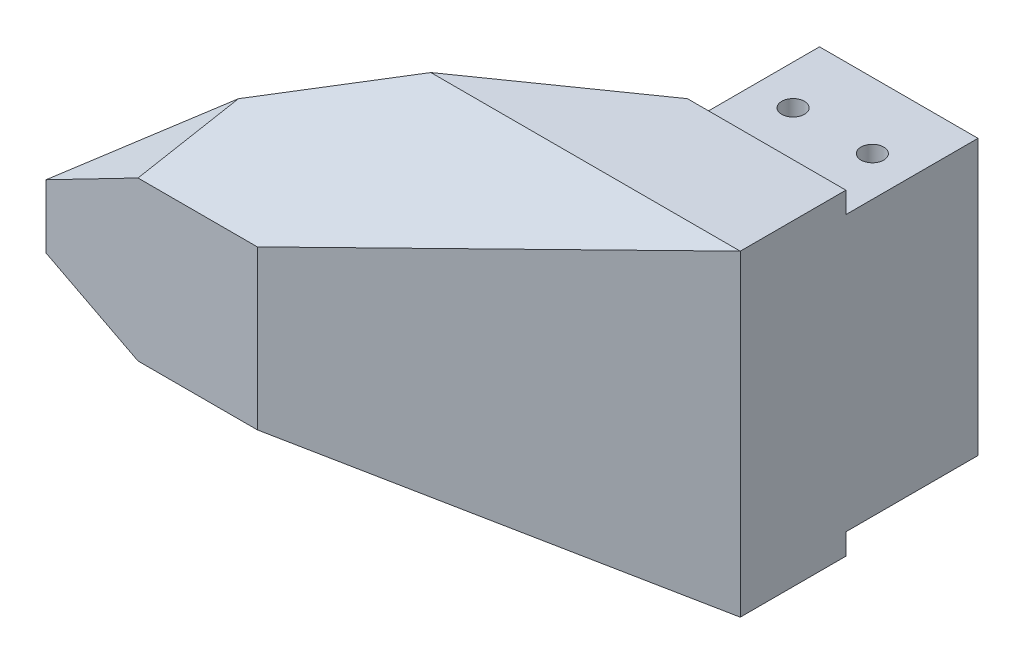
ISO-10303-21;
HEADER;
FILE_DESCRIPTION(('STEP AP214'),'2;1');
FILE_NAME('part.step','',(''),(''),'','','');
FILE_SCHEMA(('AUTOMOTIVE_DESIGN { 1 0 10303 214 1 1 1 1 }'));
ENDSEC;
DATA;
#1=APPLICATION_CONTEXT('core data for automotive mechanical design processes');
#2=APPLICATION_PROTOCOL_DEFINITION('international standard','automotive_design',2000,#1);
#3=PRODUCT_CONTEXT('',#1,'mechanical');
#4=PRODUCT('Part','Part','',(#3));
#5=PRODUCT_RELATED_PRODUCT_CATEGORY('part','',(#4));
#6=PRODUCT_DEFINITION_FORMATION('','',#4);
#7=PRODUCT_DEFINITION_CONTEXT('part definition',#1,'design');
#8=PRODUCT_DEFINITION('design','',#6,#7);
#9=PRODUCT_DEFINITION_SHAPE('','',#8);
#10=(LENGTH_UNIT() NAMED_UNIT(*) SI_UNIT(.MILLI.,.METRE.));
#11=(NAMED_UNIT(*) PLANE_ANGLE_UNIT() SI_UNIT($,.RADIAN.));
#12=(NAMED_UNIT(*) SI_UNIT($,.STERADIAN.) SOLID_ANGLE_UNIT());
#13=UNCERTAINTY_MEASURE_WITH_UNIT(LENGTH_MEASURE(1.E-05),#10,'distance_accuracy_value','');
#14=(GEOMETRIC_REPRESENTATION_CONTEXT(3) GLOBAL_UNCERTAINTY_ASSIGNED_CONTEXT((#13)) GLOBAL_UNIT_ASSIGNED_CONTEXT((#10,
#11,#12)) REPRESENTATION_CONTEXT('',''));
#15=CARTESIAN_POINT('',(0.,0.,0.));
#16=DIRECTION('',(0.,0.,1.));
#17=DIRECTION('',(1.,0.,0.));
#18=AXIS2_PLACEMENT_3D('',#15,#16,#17);
#19=CARTESIAN_POINT('',(71.4074003371065,30.,-75.));
#20=DIRECTION('',(0.,0.,1.));
#21=DIRECTION('',(1.,0.,0.));
#22=AXIS2_PLACEMENT_3D('',#19,#20,#21);
#23=PLANE('',#22);
#24=CARTESIAN_POINT('',(86.4074003371065,15.,-75.));
#25=DIRECTION('',(0.,0.,-1.));
#26=DIRECTION('',(-1.,0.,0.));
#27=AXIS2_PLACEMENT_3D('',#24,#25,#26);
#28=CIRCLE('',#27,5.);
#29=CARTESIAN_POINT('',(81.4074003371065,15.,-75.));
#30=VERTEX_POINT('',#29);
#31=EDGE_CURVE('E451',#30,#30,#28,.T.);
#32=ORIENTED_EDGE('',*,*,#31,.F.);
#33=EDGE_LOOP('',(#32));
#34=FACE_BOUND('',#33,.T.);
#35=DIRECTION('',(0.,-1.,0.));
#36=VECTOR('',#35,1.);
#37=CARTESIAN_POINT('',(71.4074003371065,30.,-75.));
#38=LINE('',#37,#36);
#39=CARTESIAN_POINT('',(71.4074003371065,41.,-75.));
#40=VERTEX_POINT('',#39);
#41=CARTESIAN_POINT('',(71.4074003371065,-11.,-75.));
#42=VERTEX_POINT('',#41);
#43=EDGE_CURVE('E141',#40,#42,#38,.T.);
#44=ORIENTED_EDGE('',*,*,#43,.F.);
#45=DIRECTION('',(-1.,0.,0.));
#46=VECTOR('',#45,1.);
#47=CARTESIAN_POINT('',(101.407400337107,41.,-75.));
#48=LINE('',#47,#46);
#49=CARTESIAN_POINT('',(101.407400337107,41.,-75.));
#50=VERTEX_POINT('',#49);
#51=EDGE_CURVE('E127',#50,#40,#48,.T.);
#52=ORIENTED_EDGE('',*,*,#51,.F.);
#53=DIRECTION('',(0.,-1.,0.));
#54=VECTOR('',#53,1.);
#55=CARTESIAN_POINT('',(101.407400337107,30.,-75.));
#56=LINE('',#55,#54);
#57=CARTESIAN_POINT('',(101.407400337107,-11.,-75.));
#58=VERTEX_POINT('',#57);
#59=EDGE_CURVE('E139',#50,#58,#56,.T.);
#60=ORIENTED_EDGE('',*,*,#59,.T.);
#61=DIRECTION('',(1.,0.,0.));
#62=VECTOR('',#61,1.);
#63=CARTESIAN_POINT('',(101.407400337107,-11.,-75.));
#64=LINE('',#63,#62);
#65=EDGE_CURVE('E214',#42,#58,#64,.T.);
#66=ORIENTED_EDGE('',*,*,#65,.F.);
#67=EDGE_LOOP('',(#44,#52,#60,#66));
#68=FACE_BOUND('',#67,.T.);
#69=ADVANCED_FACE('F36',(#34,#68),#23,.F.);
#70=CARTESIAN_POINT('',(71.4074003371065,30.,-50.));
#71=DIRECTION('',(1.,0.,0.));
#72=DIRECTION('',(0.,0.,-1.));
#73=AXIS2_PLACEMENT_3D('',#70,#71,#72);
#74=PLANE('',#73);
#75=DIRECTION('',(0.,-1.,0.));
#76=VECTOR('',#75,1.);
#77=CARTESIAN_POINT('',(71.4074003371065,30.,-50.));
#78=LINE('',#77,#76);
#79=CARTESIAN_POINT('',(71.4074003371065,41.,-50.));
#80=VERTEX_POINT('',#79);
#81=CARTESIAN_POINT('',(71.4074003371065,-11.,-50.));
#82=VERTEX_POINT('',#81);
#83=EDGE_CURVE('E191',#80,#82,#78,.T.);
#84=ORIENTED_EDGE('',*,*,#83,.F.);
#85=DIRECTION('',(0.,0.,1.));
#86=VECTOR('',#85,1.);
#87=CARTESIAN_POINT('',(71.4074003371065,41.,-75.));
#88=LINE('',#87,#86);
#89=EDGE_CURVE('E142',#40,#80,#88,.T.);
#90=ORIENTED_EDGE('',*,*,#89,.F.);
#91=ORIENTED_EDGE('',*,*,#43,.T.);
#92=DIRECTION('',(0.,0.,-1.));
#93=VECTOR('',#92,1.);
#94=CARTESIAN_POINT('',(71.4074003371065,-11.,-75.));
#95=LINE('',#94,#93);
#96=EDGE_CURVE('E211',#82,#42,#95,.T.);
#97=ORIENTED_EDGE('',*,*,#96,.F.);
#98=EDGE_LOOP('',(#84,#90,#91,#97));
#99=FACE_BOUND('',#98,.T.);
#100=ADVANCED_FACE('F213',(#99),#74,.F.);
#101=CARTESIAN_POINT('',(40.,30.,0.));
#102=DIRECTION('',(0.,0.,-1.));
#103=DIRECTION('',(-1.,0.,0.));
#104=AXIS2_PLACEMENT_3D('',#101,#102,#103);
#105=PLANE('',#104);
#106=DIRECTION('',(1.,0.,0.));
#107=VECTOR('',#106,1.);
#108=CARTESIAN_POINT('',(40.,30.,0.));
#109=LINE('',#108,#107);
#110=CARTESIAN_POINT('',(17.4138180950604,30.,0.));
#111=VERTEX_POINT('',#110);
#112=CARTESIAN_POINT('',(40.,30.,0.));
#113=VERTEX_POINT('',#112);
#114=EDGE_CURVE('E183',#111,#113,#109,.T.);
#115=ORIENTED_EDGE('',*,*,#114,.F.);
#116=DIRECTION('',(-0.888366385841765,-0.459135235531363,0.));
#117=VECTOR('',#116,1.);
#118=CARTESIAN_POINT('',(35.2387162079568,39.2124588726222,0.));
#119=LINE('',#118,#117);
#120=CARTESIAN_POINT('',(0.,21.,0.));
#121=VERTEX_POINT('',#120);
#122=EDGE_CURVE('E58',#111,#121,#119,.T.);
#123=ORIENTED_EDGE('',*,*,#122,.T.);
#124=DIRECTION('',(0.,-1.,0.));
#125=VECTOR('',#124,1.);
#126=CARTESIAN_POINT('',(0.,30.,0.));
#127=LINE('',#126,#125);
#128=CARTESIAN_POINT('',(0.,9.,0.));
#129=VERTEX_POINT('',#128);
#130=EDGE_CURVE('E178',#121,#129,#127,.T.);
#131=ORIENTED_EDGE('',*,*,#130,.T.);
#132=DIRECTION('',(0.888366385841765,-0.459135235531363,0.));
#133=VECTOR('',#132,1.);
#134=CARTESIAN_POINT('',(23.0023069139087,-2.88830393742893,0.));
#135=LINE('',#134,#133);
#136=CARTESIAN_POINT('',(17.4138180950604,0.,0.));
#137=VERTEX_POINT('',#136);
#138=EDGE_CURVE('E164',#129,#137,#135,.T.);
#139=ORIENTED_EDGE('',*,*,#138,.T.);
#140=DIRECTION('',(1.,0.,0.));
#141=VECTOR('',#140,1.);
#142=CARTESIAN_POINT('',(40.,0.,0.));
#143=LINE('',#142,#141);
#144=CARTESIAN_POINT('',(40.0000000000001,0.,0.));
#145=VERTEX_POINT('',#144);
#146=EDGE_CURVE('E175',#137,#145,#143,.T.);
#147=ORIENTED_EDGE('',*,*,#146,.T.);
#148=DIRECTION('',(0.,-1.,0.));
#149=VECTOR('',#148,1.);
#150=CARTESIAN_POINT('',(40.,30.,0.));
#151=LINE('',#150,#149);
#152=EDGE_CURVE('E150',#113,#145,#151,.T.);
#153=ORIENTED_EDGE('',*,*,#152,.F.);
#154=EDGE_LOOP('',(#115,#123,#131,#139,#147,#153));
#155=FACE_BOUND('',#154,.T.);
#156=ADVANCED_FACE('F38',(#155),#105,.F.);
#157=CARTESIAN_POINT('',(101.407400337107,30.,-30.));
#158=DIRECTION('',(-0.438957445353124,0.,-0.898507852591762));
#159=DIRECTION('',(-0.898507852591762,0.,0.438957445353124));
#160=AXIS2_PLACEMENT_3D('',#157,#158,#159);
#161=PLANE('',#160);
#162=ORIENTED_EDGE('',*,*,#152,.T.);
#163=DIRECTION('',(0.877618613830245,-0.214376103453103,-0.428752206906207));
#164=VECTOR('',#163,1.);
#165=CARTESIAN_POINT('',(23.3019571526603,4.0788348201535,8.157669640307));
#166=LINE('',#165,#164);
#167=CARTESIAN_POINT('',(101.407400337107,-15.,-30.));
#168=VERTEX_POINT('',#167);
#169=EDGE_CURVE('E158',#145,#168,#166,.T.);
#170=ORIENTED_EDGE('',*,*,#169,.T.);
#171=DIRECTION('',(0.,-1.,0.));
#172=VECTOR('',#171,1.);
#173=CARTESIAN_POINT('',(101.407400337107,30.,-30.));
#174=LINE('',#173,#172);
#175=CARTESIAN_POINT('',(101.407400337107,45.,-30.));
#176=VERTEX_POINT('',#175);
#177=EDGE_CURVE('E148',#176,#168,#174,.T.);
#178=ORIENTED_EDGE('',*,*,#177,.F.);
#179=DIRECTION('',(-0.877618613830246,-0.214376103453103,0.428752206906207));
#180=VECTOR('',#179,1.);
#181=CARTESIAN_POINT('',(9.19142274634713,22.4743816499663,15.0512367000674));
#182=LINE('',#181,#180);
#183=EDGE_CURVE('E234',#176,#113,#182,.T.);
#184=ORIENTED_EDGE('',*,*,#183,.T.);
#185=EDGE_LOOP('',(#162,#170,#178,#184));
#186=FACE_BOUND('',#185,.T.);
#187=ADVANCED_FACE('F248',(#186),#161,.F.);
#188=CARTESIAN_POINT('',(101.407400337107,30.,-75.));
#189=DIRECTION('',(-1.,0.,0.));
#190=DIRECTION('',(0.,0.,1.));
#191=AXIS2_PLACEMENT_3D('',#188,#189,#190);
#192=PLANE('',#191);
#193=DIRECTION('',(0.,0.,-1.));
#194=VECTOR('',#193,1.);
#195=CARTESIAN_POINT('',(101.407400337107,41.,-75.));
#196=LINE('',#195,#194);
#197=CARTESIAN_POINT('',(101.407400337107,41.,-50.));
#198=VERTEX_POINT('',#197);
#199=EDGE_CURVE('E124',#198,#50,#196,.T.);
#200=ORIENTED_EDGE('',*,*,#199,.F.);
#201=DIRECTION('',(0.,1.,0.));
#202=VECTOR('',#201,1.);
#203=CARTESIAN_POINT('',(101.407400337107,41.,-50.));
#204=LINE('',#203,#202);
#205=CARTESIAN_POINT('',(101.407400337107,45.,-50.));
#206=VERTEX_POINT('',#205);
#207=EDGE_CURVE('E219',#198,#206,#204,.T.);
#208=ORIENTED_EDGE('',*,*,#207,.T.);
#209=DIRECTION('',(0.,0.,1.));
#210=VECTOR('',#209,1.);
#211=CARTESIAN_POINT('',(101.407400337107,45.,-30.));
#212=LINE('',#211,#210);
#213=EDGE_CURVE('E188',#206,#176,#212,.T.);
#214=ORIENTED_EDGE('',*,*,#213,.T.);
#215=ORIENTED_EDGE('',*,*,#177,.T.);
#216=DIRECTION('',(0.,0.,-1.));
#217=VECTOR('',#216,1.);
#218=CARTESIAN_POINT('',(101.407400337107,-15.,-75.));
#219=LINE('',#218,#217);
#220=CARTESIAN_POINT('',(101.407400337107,-15.,-50.));
#221=VERTEX_POINT('',#220);
#222=EDGE_CURVE('E237',#168,#221,#219,.T.);
#223=ORIENTED_EDGE('',*,*,#222,.T.);
#224=DIRECTION('',(0.,-1.,0.));
#225=VECTOR('',#224,1.);
#226=CARTESIAN_POINT('',(101.407400337107,-11.,-50.));
#227=LINE('',#226,#225);
#228=CARTESIAN_POINT('',(101.407400337107,-11.,-50.));
#229=VERTEX_POINT('',#228);
#230=EDGE_CURVE('E51',#229,#221,#227,.T.);
#231=ORIENTED_EDGE('',*,*,#230,.F.);
#232=DIRECTION('',(0.,0.,1.));
#233=VECTOR('',#232,1.);
#234=CARTESIAN_POINT('',(101.407400337107,-11.,-75.));
#235=LINE('',#234,#233);
#236=EDGE_CURVE('E147',#58,#229,#235,.T.);
#237=ORIENTED_EDGE('',*,*,#236,.F.);
#238=ORIENTED_EDGE('',*,*,#59,.F.);
#239=EDGE_LOOP('',(#200,#208,#214,#215,#223,#231,#237,#238));
#240=FACE_BOUND('',#239,.T.);
#241=ADVANCED_FACE('F145',(#240),#192,.F.);
#242=CARTESIAN_POINT('',(0.,30.,0.));
#243=DIRECTION('',(0.573576436351042,0.,0.819152044288995));
#244=DIRECTION('',(0.819152044288995,0.,-0.573576436351042));
#245=AXIS2_PLACEMENT_3D('',#242,#243,#244);
#246=PLANE('',#245);
#247=ORIENTED_EDGE('',*,*,#130,.F.);
#248=DIRECTION('',(-0.692785592880849,-0.533603063948073,0.485093694498248));
#249=VECTOR('',#248,1.);
#250=CARTESIAN_POINT('',(0.,21.,0.));
#251=LINE('',#250,#249);
#252=CARTESIAN_POINT('',(21.422220101132,37.5,-15.));
#253=VERTEX_POINT('',#252);
#254=EDGE_CURVE('E179',#253,#121,#251,.T.);
#255=ORIENTED_EDGE('',*,*,#254,.F.);
#256=DIRECTION('',(0.787410546494737,0.275675400160718,-0.551350800321436));
#257=VECTOR('',#256,1.);
#258=CARTESIAN_POINT('',(0.,30.,0.));
#259=LINE('',#258,#257);
#260=CARTESIAN_POINT('',(42.8444402022639,45.,-30.));
#261=VERTEX_POINT('',#260);
#262=EDGE_CURVE('E232',#253,#261,#259,.T.);
#263=ORIENTED_EDGE('',*,*,#262,.T.);
#264=DIRECTION('',(-0.819152044288995,0.,0.573576436351042));
#265=VECTOR('',#264,1.);
#266=CARTESIAN_POINT('',(71.4074003371065,45.,-50.));
#267=LINE('',#266,#265);
#268=CARTESIAN_POINT('',(71.4074003371065,45.,-50.));
#269=VERTEX_POINT('',#268);
#270=EDGE_CURVE('E226',#269,#261,#267,.T.);
#271=ORIENTED_EDGE('',*,*,#270,.F.);
#272=EDGE_CURVE('E152',#269,#80,#78,.T.);
#273=ORIENTED_EDGE('',*,*,#272,.T.);
#274=ORIENTED_EDGE('',*,*,#83,.T.);
#275=DIRECTION('',(0.,-1.,0.));
#276=VECTOR('',#275,1.);
#277=CARTESIAN_POINT('',(71.4074003371065,-11.,-50.));
#278=LINE('',#277,#276);
#279=CARTESIAN_POINT('',(71.4074003371065,-15.,-50.));
#280=VERTEX_POINT('',#279);
#281=EDGE_CURVE('E199',#82,#280,#278,.T.);
#282=ORIENTED_EDGE('',*,*,#281,.T.);
#283=DIRECTION('',(-0.819152044288995,0.,0.573576436351042));
#284=VECTOR('',#283,1.);
#285=CARTESIAN_POINT('',(71.4074003371065,-15.,-50.));
#286=LINE('',#285,#284);
#287=CARTESIAN_POINT('',(42.8444402022639,-15.,-30.));
#288=VERTEX_POINT('',#287);
#289=EDGE_CURVE('E225',#280,#288,#286,.T.);
#290=ORIENTED_EDGE('',*,*,#289,.T.);
#291=DIRECTION('',(-0.787410546494737,0.275675400160718,0.551350800321436));
#292=VECTOR('',#291,1.);
#293=CARTESIAN_POINT('',(16.280228812178,-5.69976946903289,-11.3995389380658));
#294=LINE('',#293,#292);
#295=CARTESIAN_POINT('',(21.422220101132,-7.5,-15.));
#296=VERTEX_POINT('',#295);
#297=EDGE_CURVE('E229',#288,#296,#294,.T.);
#298=ORIENTED_EDGE('',*,*,#297,.T.);
#299=DIRECTION('',(0.692785592880849,-0.533603063948073,-0.485093694498248));
#300=VECTOR('',#299,1.);
#301=CARTESIAN_POINT('',(21.4222201011319,-7.5,-15.));
#302=LINE('',#301,#300);
#303=EDGE_CURVE('E166',#129,#296,#302,.T.);
#304=ORIENTED_EDGE('',*,*,#303,.F.);
#305=EDGE_LOOP('',(#247,#255,#263,#271,#273,#274,#282,#290,#298,#304));
#306=FACE_BOUND('',#305,.T.);
#307=ADVANCED_FACE('F198',(#306),#246,.F.);
#308=CARTESIAN_POINT('',(0.,30.,0.));
#309=DIRECTION('',(0.,0.894427190999916,0.447213595499958));
#310=DIRECTION('',(0.,-0.447213595499958,0.894427190999916));
#311=AXIS2_PLACEMENT_3D('',#308,#309,#310);
#312=PLANE('',#311);
#313=DIRECTION('',(0.232466935443777,0.434961865897547,-0.869923731795094));
#314=VECTOR('',#313,1.);
#315=CARTESIAN_POINT('',(16.4727601093993,28.239214808852,3.52157038229605));
#316=LINE('',#315,#314);
#317=EDGE_CURVE('E11',#111,#253,#316,.T.);
#318=ORIENTED_EDGE('',*,*,#317,.F.);
#319=ORIENTED_EDGE('',*,*,#114,.T.);
#320=ORIENTED_EDGE('',*,*,#183,.F.);
#321=DIRECTION('',(1.,0.,0.));
#322=VECTOR('',#321,1.);
#323=CARTESIAN_POINT('',(0.,45.,-30.));
#324=LINE('',#323,#322);
#325=EDGE_CURVE('E184',#261,#176,#324,.T.);
#326=ORIENTED_EDGE('',*,*,#325,.F.);
#327=ORIENTED_EDGE('',*,*,#262,.F.);
#328=EDGE_LOOP('',(#318,#319,#320,#326,#327));
#329=FACE_BOUND('',#328,.T.);
#330=ADVANCED_FACE('F251',(#329),#312,.T.);
#331=CARTESIAN_POINT('',(0.,45.,-30.));
#332=DIRECTION('',(0.,1.,0.));
#333=DIRECTION('',(0.,0.,1.));
#334=AXIS2_PLACEMENT_3D('',#331,#332,#333);
#335=PLANE('',#334);
#336=DIRECTION('',(1.,0.,0.));
#337=VECTOR('',#336,1.);
#338=CARTESIAN_POINT('',(101.407400337107,45.,-50.));
#339=LINE('',#338,#337);
#340=EDGE_CURVE('E134',#269,#206,#339,.T.);
#341=ORIENTED_EDGE('',*,*,#340,.F.);
#342=ORIENTED_EDGE('',*,*,#270,.T.);
#343=ORIENTED_EDGE('',*,*,#325,.T.);
#344=ORIENTED_EDGE('',*,*,#213,.F.);
#345=EDGE_LOOP('',(#341,#342,#343,#344));
#346=FACE_BOUND('',#345,.T.);
#347=ADVANCED_FACE('F253',(#346),#335,.T.);
#348=CARTESIAN_POINT('',(0.,-15.,-30.));
#349=DIRECTION('',(0.,-0.894427190999916,0.447213595499958));
#350=DIRECTION('',(0.,-0.447213595499958,-0.894427190999916));
#351=AXIS2_PLACEMENT_3D('',#348,#349,#350);
#352=PLANE('',#351);
#353=DIRECTION('',(-0.232466935443778,0.434961865897547,0.869923731795094));
#354=VECTOR('',#353,1.);
#355=CARTESIAN_POINT('',(24.0563290094075,-12.4286016677326,-24.8572033354653));
#356=LINE('',#355,#354);
#357=EDGE_CURVE('E44',#296,#137,#356,.T.);
#358=ORIENTED_EDGE('',*,*,#357,.F.);
#359=ORIENTED_EDGE('',*,*,#297,.F.);
#360=DIRECTION('',(1.,0.,0.));
#361=VECTOR('',#360,1.);
#362=CARTESIAN_POINT('',(0.,-15.,-30.));
#363=LINE('',#362,#361);
#364=EDGE_CURVE('E240',#288,#168,#363,.T.);
#365=ORIENTED_EDGE('',*,*,#364,.T.);
#366=ORIENTED_EDGE('',*,*,#169,.F.);
#367=ORIENTED_EDGE('',*,*,#146,.F.);
#368=EDGE_LOOP('',(#358,#359,#365,#366,#367));
#369=FACE_BOUND('',#368,.T.);
#370=ADVANCED_FACE('F181',(#369),#352,.T.);
#371=CARTESIAN_POINT('',(0.,-15.,-75.));
#372=DIRECTION('',(0.,-1.,0.));
#373=DIRECTION('',(0.,0.,-1.));
#374=AXIS2_PLACEMENT_3D('',#371,#372,#373);
#375=PLANE('',#374);
#376=DIRECTION('',(-1.,0.,0.));
#377=VECTOR('',#376,1.);
#378=CARTESIAN_POINT('',(101.407400337107,-15.,-50.));
#379=LINE('',#378,#377);
#380=EDGE_CURVE('E206',#221,#280,#379,.T.);
#381=ORIENTED_EDGE('',*,*,#380,.F.);
#382=ORIENTED_EDGE('',*,*,#222,.F.);
#383=ORIENTED_EDGE('',*,*,#364,.F.);
#384=ORIENTED_EDGE('',*,*,#289,.F.);
#385=EDGE_LOOP('',(#381,#382,#383,#384));
#386=FACE_BOUND('',#385,.T.);
#387=ADVANCED_FACE('F258',(#386),#375,.T.);
#388=CARTESIAN_POINT('',(54.7842334708944,-7.5,32.6458928949306));
#389=DIRECTION('',(0.437102040671935,0.845735047248977,-0.306062143845333));
#390=DIRECTION('',(-0.888366385841765,0.459135235531363,0.));
#391=AXIS2_PLACEMENT_3D('',#388,#389,#390);
#392=PLANE('',#391);
#393=ORIENTED_EDGE('',*,*,#303,.T.);
#394=ORIENTED_EDGE('',*,*,#357,.T.);
#395=ORIENTED_EDGE('',*,*,#138,.F.);
#396=EDGE_LOOP('',(#393,#394,#395));
#397=FACE_BOUND('',#396,.T.);
#398=ADVANCED_FACE('F163',(#397),#392,.F.);
#399=CARTESIAN_POINT('',(33.3620133697624,21.,47.6458928949306));
#400=DIRECTION('',(0.437102040671935,-0.845735047248977,-0.306062143845333));
#401=DIRECTION('',(0.888366385841765,0.459135235531363,0.));
#402=AXIS2_PLACEMENT_3D('',#399,#400,#401);
#403=PLANE('',#402);
#404=ORIENTED_EDGE('',*,*,#317,.T.);
#405=ORIENTED_EDGE('',*,*,#254,.T.);
#406=ORIENTED_EDGE('',*,*,#122,.F.);
#407=EDGE_LOOP('',(#404,#405,#406));
#408=FACE_BOUND('',#407,.T.);
#409=ADVANCED_FACE('F265',(#408),#403,.F.);
#410=CARTESIAN_POINT('',(101.407400337107,-11.,-50.));
#411=DIRECTION('',(0.,0.,1.));
#412=DIRECTION('',(0.,-1.,0.));
#413=AXIS2_PLACEMENT_3D('',#410,#411,#412);
#414=PLANE('',#413);
#415=ORIENTED_EDGE('',*,*,#380,.T.);
#416=ORIENTED_EDGE('',*,*,#281,.F.);
#417=DIRECTION('',(-1.,0.,0.));
#418=VECTOR('',#417,1.);
#419=CARTESIAN_POINT('',(101.407400337107,-11.,-50.));
#420=LINE('',#419,#418);
#421=EDGE_CURVE('E205',#229,#82,#420,.T.);
#422=ORIENTED_EDGE('',*,*,#421,.F.);
#423=ORIENTED_EDGE('',*,*,#230,.T.);
#424=EDGE_LOOP('',(#415,#416,#422,#423));
#425=FACE_BOUND('',#424,.T.);
#426=ADVANCED_FACE('F204',(#425),#414,.F.);
#427=CARTESIAN_POINT('',(0.,-11.,0.));
#428=DIRECTION('',(0.,-1.,0.));
#429=DIRECTION('',(0.,0.,-1.));
#430=AXIS2_PLACEMENT_3D('',#427,#428,#429);
#431=PLANE('',#430);
#432=CARTESIAN_POINT('',(78.9074003371065,-11.,-62.5));
#433=DIRECTION('',(0.,-1.,0.));
#434=DIRECTION('',(0.,0.,-1.));
#435=AXIS2_PLACEMENT_3D('',#432,#433,#434);
#436=CIRCLE('',#435,2.15);
#437=CARTESIAN_POINT('',(78.9074003371065,-11.,-60.35));
#438=VERTEX_POINT('',#437);
#439=EDGE_CURVE('E464',#438,#438,#436,.T.);
#440=ORIENTED_EDGE('',*,*,#439,.F.);
#441=EDGE_LOOP('',(#440));
#442=FACE_BOUND('',#441,.T.);
#443=CARTESIAN_POINT('',(93.9074003371065,-11.,-62.5));
#444=DIRECTION('',(0.,-1.,0.));
#445=DIRECTION('',(0.,0.,-1.));
#446=AXIS2_PLACEMENT_3D('',#443,#444,#445);
#447=CIRCLE('',#446,2.15);
#448=CARTESIAN_POINT('',(93.9074003371065,-11.,-60.35));
#449=VERTEX_POINT('',#448);
#450=EDGE_CURVE('E460',#449,#449,#447,.T.);
#451=ORIENTED_EDGE('',*,*,#450,.F.);
#452=EDGE_LOOP('',(#451));
#453=FACE_BOUND('',#452,.T.);
#454=ORIENTED_EDGE('',*,*,#236,.T.);
#455=ORIENTED_EDGE('',*,*,#421,.T.);
#456=ORIENTED_EDGE('',*,*,#96,.T.);
#457=ORIENTED_EDGE('',*,*,#65,.T.);
#458=EDGE_LOOP('',(#454,#455,#456,#457));
#459=FACE_BOUND('',#458,.T.);
#460=ADVANCED_FACE('F210',(#442,#453,#459),#431,.T.);
#461=CARTESIAN_POINT('',(101.407400337107,41.,-50.));
#462=DIRECTION('',(0.,0.,1.));
#463=DIRECTION('',(1.,0.,0.));
#464=AXIS2_PLACEMENT_3D('',#461,#462,#463);
#465=PLANE('',#464);
#466=ORIENTED_EDGE('',*,*,#340,.T.);
#467=ORIENTED_EDGE('',*,*,#207,.F.);
#468=DIRECTION('',(1.,0.,0.));
#469=VECTOR('',#468,1.);
#470=CARTESIAN_POINT('',(101.407400337107,41.,-50.));
#471=LINE('',#470,#469);
#472=EDGE_CURVE('E130',#80,#198,#471,.T.);
#473=ORIENTED_EDGE('',*,*,#472,.F.);
#474=ORIENTED_EDGE('',*,*,#272,.F.);
#475=EDGE_LOOP('',(#466,#467,#473,#474));
#476=FACE_BOUND('',#475,.T.);
#477=ADVANCED_FACE('F329',(#476),#465,.F.);
#478=CARTESIAN_POINT('',(0.,41.,0.));
#479=DIRECTION('',(0.,-1.,0.));
#480=DIRECTION('',(0.,0.,-1.));
#481=AXIS2_PLACEMENT_3D('',#478,#479,#480);
#482=PLANE('',#481);
#483=CARTESIAN_POINT('',(78.9074003371065,41.,-62.5));
#484=DIRECTION('',(0.,1.,0.));
#485=DIRECTION('',(0.,0.,1.));
#486=AXIS2_PLACEMENT_3D('',#483,#484,#485);
#487=CIRCLE('',#486,2.15);
#488=CARTESIAN_POINT('',(78.9074003371065,41.,-60.35));
#489=VERTEX_POINT('',#488);
#490=EDGE_CURVE('E454',#489,#489,#487,.T.);
#491=ORIENTED_EDGE('',*,*,#490,.F.);
#492=EDGE_LOOP('',(#491));
#493=FACE_BOUND('',#492,.T.);
#494=CARTESIAN_POINT('',(93.9074003371065,41.,-62.5));
#495=DIRECTION('',(0.,1.,0.));
#496=DIRECTION('',(0.,0.,1.));
#497=AXIS2_PLACEMENT_3D('',#494,#495,#496);
#498=CIRCLE('',#497,2.15);
#499=CARTESIAN_POINT('',(93.9074003371065,41.,-60.35));
#500=VERTEX_POINT('',#499);
#501=EDGE_CURVE('E450',#500,#500,#498,.T.);
#502=ORIENTED_EDGE('',*,*,#501,.F.);
#503=EDGE_LOOP('',(#502));
#504=FACE_BOUND('',#503,.T.);
#505=ORIENTED_EDGE('',*,*,#199,.T.);
#506=ORIENTED_EDGE('',*,*,#51,.T.);
#507=ORIENTED_EDGE('',*,*,#89,.T.);
#508=ORIENTED_EDGE('',*,*,#472,.T.);
#509=EDGE_LOOP('',(#505,#506,#507,#508));
#510=FACE_BOUND('',#509,.T.);
#511=ADVANCED_FACE('F126',(#493,#504,#510),#482,.F.);
#512=CARTESIAN_POINT('',(93.9074003371065,-15.,-62.5));
#513=DIRECTION('',(0.,1.,0.));
#514=DIRECTION('',(0.,0.,1.));
#515=AXIS2_PLACEMENT_3D('',#512,#513,#514);
#516=CYLINDRICAL_SURFACE('',#515,2.15);
#517=CARTESIAN_POINT('',(93.9074003371065,-11.,-60.35));
#518=CARTESIAN_POINT('',(93.9074003371065,-10.4583333333333,-60.35));
#519=CARTESIAN_POINT('',(93.9074003371065,-9.91666666666667,-60.35));
#520=CARTESIAN_POINT('',(93.9074003371065,-8.83333333333334,-60.35));
#521=CARTESIAN_POINT('',(93.9074003371065,-8.29166666666667,-60.35));
#522=CARTESIAN_POINT('',(93.9074003371065,-7.20833333333333,-60.35));
#523=CARTESIAN_POINT('',(93.9074003371065,-6.66666666666667,-60.35));
#524=CARTESIAN_POINT('',(93.9074003371065,-5.58333333333334,-60.35));
#525=CARTESIAN_POINT('',(93.9074003371065,-5.04166666666667,-60.35));
#526=CARTESIAN_POINT('',(93.9074003371065,-3.95833333333334,-60.35));
#527=CARTESIAN_POINT('',(93.9074003371065,-3.41666666666667,-60.35));
#528=CARTESIAN_POINT('',(93.9074003371065,-2.33333333333334,-60.35));
#529=CARTESIAN_POINT('',(93.9074003371065,-1.79166666666667,-60.35));
#530=CARTESIAN_POINT('',(93.9074003371065,-0.708333333333336,-60.35));
#531=CARTESIAN_POINT('',(93.9074003371065,-0.166666666666669,-60.35));
#532=CARTESIAN_POINT('',(93.9074003371065,0.916666666666663,-60.35));
#533=CARTESIAN_POINT('',(93.9074003371065,1.45833333333333,-60.35));
#534=CARTESIAN_POINT('',(93.9074003371065,2.54166666666666,-60.35));
#535=CARTESIAN_POINT('',(93.9074003371065,3.08333333333333,-60.35));
#536=CARTESIAN_POINT('',(93.9074003371065,4.16666666666666,-60.35));
#537=CARTESIAN_POINT('',(93.9074003371065,4.70833333333333,-60.35));
#538=CARTESIAN_POINT('',(93.9074003371065,5.79166666666666,-60.35));
#539=CARTESIAN_POINT('',(93.9074003371065,6.33333333333333,-60.35));
#540=CARTESIAN_POINT('',(93.9074003371065,7.41666666666666,-60.35));
#541=CARTESIAN_POINT('',(93.9074003371065,7.95833333333333,-60.35));
#542=CARTESIAN_POINT('',(93.9074003371065,9.04166666666666,-60.35));
#543=CARTESIAN_POINT('',(93.9074003371065,9.58333333333333,-60.35));
#544=CARTESIAN_POINT('',(93.9074003371065,10.6666666666667,-60.35));
#545=CARTESIAN_POINT('',(93.9074003371065,11.2083333333333,-60.35));
#546=CARTESIAN_POINT('',(93.9074003371065,12.2916666666667,-60.35));
#547=CARTESIAN_POINT('',(93.9074003371065,12.8333333333333,-60.35));
#548=CARTESIAN_POINT('',(93.9074003371065,13.9166666666667,-60.35));
#549=CARTESIAN_POINT('',(93.9074003371065,14.4583333333333,-60.35));
#550=CARTESIAN_POINT('',(93.9074003371065,15.5416666666667,-60.35));
#551=CARTESIAN_POINT('',(93.9074003371065,16.0833333333333,-60.35));
#552=CARTESIAN_POINT('',(93.9074003371065,17.1666666666667,-60.35));
#553=CARTESIAN_POINT('',(93.9074003371065,17.7083333333333,-60.35));
#554=CARTESIAN_POINT('',(93.9074003371065,18.7916666666667,-60.35));
#555=CARTESIAN_POINT('',(93.9074003371065,19.3333333333333,-60.35));
#556=CARTESIAN_POINT('',(93.9074003371065,20.4166666666667,-60.35));
#557=CARTESIAN_POINT('',(93.9074003371065,20.9583333333333,-60.35));
#558=CARTESIAN_POINT('',(93.9074003371065,22.0416666666667,-60.35));
#559=CARTESIAN_POINT('',(93.9074003371065,22.5833333333333,-60.35));
#560=CARTESIAN_POINT('',(93.9074003371065,23.6666666666667,-60.35));
#561=CARTESIAN_POINT('',(93.9074003371065,24.2083333333333,-60.35));
#562=CARTESIAN_POINT('',(93.9074003371065,25.2916666666667,-60.35));
#563=CARTESIAN_POINT('',(93.9074003371065,25.8333333333333,-60.35));
#564=CARTESIAN_POINT('',(93.9074003371065,26.9166666666667,-60.35));
#565=CARTESIAN_POINT('',(93.9074003371065,27.4583333333333,-60.35));
#566=CARTESIAN_POINT('',(93.9074003371065,28.5416666666667,-60.35));
#567=CARTESIAN_POINT('',(93.9074003371065,29.0833333333333,-60.35));
#568=CARTESIAN_POINT('',(93.9074003371065,30.1666666666667,-60.35));
#569=CARTESIAN_POINT('',(93.9074003371065,30.7083333333333,-60.35));
#570=CARTESIAN_POINT('',(93.9074003371065,31.7916666666667,-60.35));
#571=CARTESIAN_POINT('',(93.9074003371065,32.3333333333333,-60.35));
#572=CARTESIAN_POINT('',(93.9074003371065,33.4166666666667,-60.35));
#573=CARTESIAN_POINT('',(93.9074003371065,33.9583333333333,-60.35));
#574=CARTESIAN_POINT('',(93.9074003371065,35.0416666666667,-60.35));
#575=CARTESIAN_POINT('',(93.9074003371065,35.5833333333333,-60.35));
#576=CARTESIAN_POINT('',(93.9074003371065,36.6666666666667,-60.35));
#577=CARTESIAN_POINT('',(93.9074003371065,37.2083333333333,-60.35));
#578=CARTESIAN_POINT('',(93.9074003371065,38.2916666666667,-60.35));
#579=CARTESIAN_POINT('',(93.9074003371065,38.8333333333333,-60.35));
#580=CARTESIAN_POINT('',(93.9074003371065,39.9166666666667,-60.35));
#581=CARTESIAN_POINT('',(93.9074003371065,40.4583333333333,-60.35));
#582=CARTESIAN_POINT('',(93.9074003371065,41.,-60.35));
#583=B_SPLINE_CURVE_WITH_KNOTS('',3,(#517,#518,#519,#520,#521,#522,#523,#524,#525,#526,#527,
#528,#529,#530,#531,#532,#533,#534,#535,#536,#537,#538,#539,#540,#541,#542,#543,#544,#545,#546,
#547,#548,#549,#550,#551,#552,#553,#554,#555,#556,#557,#558,#559,#560,#561,#562,#563,#564,#565,
#566,#567,#568,#569,#570,#571,#572,#573,#574,#575,#576,#577,#578,#579,#580,#581,#582),
.UNSPECIFIED.,.F.,.F.,(4,2,2,2,2,2,2,2,2,2,2,2,2,2,2,2,2,2,2,2,2,2,2,2,2,2,2,2,2,2,2,2,4),(0.,
1.625,3.25,4.875,6.5,8.125,9.75,11.375,13.,14.625,16.25,17.875,19.5,21.125,22.75,24.375,26.,
27.625,29.25,30.875,32.5,34.125,35.75,37.375,39.,40.625,42.25,43.875,45.5,47.125,48.75,50.375,
52.),.UNSPECIFIED.);
#584=EDGE_CURVE('BSEAM352',#449,#500,#583,.T.);
#585=ORIENTED_EDGE('',*,*,#450,.T.);
#586=ORIENTED_EDGE('',*,*,#501,.T.);
#587=ORIENTED_EDGE('',*,*,#584,.T.);
#588=ORIENTED_EDGE('',*,*,#584,.F.);
#589=EDGE_LOOP('',(#585,#587,#586,#588));
#590=FACE_BOUND('',#589,.T.);
#591=ADVANCED_FACE('F352',(#590),#516,.F.);
#592=CARTESIAN_POINT('',(78.9074003371065,-15.,-62.5));
#593=DIRECTION('',(0.,1.,0.));
#594=DIRECTION('',(0.,0.,1.));
#595=AXIS2_PLACEMENT_3D('',#592,#593,#594);
#596=CYLINDRICAL_SURFACE('',#595,2.15);
#597=CARTESIAN_POINT('',(78.9074003371065,-11.,-60.35));
#598=CARTESIAN_POINT('',(78.9074003371065,-10.4583333333333,-60.35));
#599=CARTESIAN_POINT('',(78.9074003371065,-9.91666666666667,-60.35));
#600=CARTESIAN_POINT('',(78.9074003371065,-8.83333333333334,-60.35));
#601=CARTESIAN_POINT('',(78.9074003371065,-8.29166666666667,-60.35));
#602=CARTESIAN_POINT('',(78.9074003371065,-7.20833333333333,-60.35));
#603=CARTESIAN_POINT('',(78.9074003371065,-6.66666666666667,-60.35));
#604=CARTESIAN_POINT('',(78.9074003371065,-5.58333333333334,-60.35));
#605=CARTESIAN_POINT('',(78.9074003371065,-5.04166666666667,-60.35));
#606=CARTESIAN_POINT('',(78.9074003371065,-3.95833333333334,-60.35));
#607=CARTESIAN_POINT('',(78.9074003371065,-3.41666666666667,-60.35));
#608=CARTESIAN_POINT('',(78.9074003371065,-2.33333333333334,-60.35));
#609=CARTESIAN_POINT('',(78.9074003371065,-1.79166666666667,-60.35));
#610=CARTESIAN_POINT('',(78.9074003371065,-0.708333333333336,-60.35));
#611=CARTESIAN_POINT('',(78.9074003371065,-0.166666666666669,-60.35));
#612=CARTESIAN_POINT('',(78.9074003371065,0.916666666666663,-60.35));
#613=CARTESIAN_POINT('',(78.9074003371065,1.45833333333333,-60.35));
#614=CARTESIAN_POINT('',(78.9074003371065,2.54166666666666,-60.35));
#615=CARTESIAN_POINT('',(78.9074003371065,3.08333333333333,-60.35));
#616=CARTESIAN_POINT('',(78.9074003371065,4.16666666666666,-60.35));
#617=CARTESIAN_POINT('',(78.9074003371065,4.70833333333333,-60.35));
#618=CARTESIAN_POINT('',(78.9074003371065,5.79166666666666,-60.35));
#619=CARTESIAN_POINT('',(78.9074003371065,6.33333333333333,-60.35));
#620=CARTESIAN_POINT('',(78.9074003371065,7.41666666666666,-60.35));
#621=CARTESIAN_POINT('',(78.9074003371065,7.95833333333333,-60.35));
#622=CARTESIAN_POINT('',(78.9074003371065,9.04166666666666,-60.35));
#623=CARTESIAN_POINT('',(78.9074003371065,9.58333333333333,-60.35));
#624=CARTESIAN_POINT('',(78.9074003371065,10.6666666666667,-60.35));
#625=CARTESIAN_POINT('',(78.9074003371065,11.2083333333333,-60.35));
#626=CARTESIAN_POINT('',(78.9074003371065,12.2916666666667,-60.35));
#627=CARTESIAN_POINT('',(78.9074003371065,12.8333333333333,-60.35));
#628=CARTESIAN_POINT('',(78.9074003371065,13.9166666666667,-60.35));
#629=CARTESIAN_POINT('',(78.9074003371065,14.4583333333333,-60.35));
#630=CARTESIAN_POINT('',(78.9074003371065,15.5416666666667,-60.35));
#631=CARTESIAN_POINT('',(78.9074003371065,16.0833333333333,-60.35));
#632=CARTESIAN_POINT('',(78.9074003371065,17.1666666666667,-60.35));
#633=CARTESIAN_POINT('',(78.9074003371065,17.7083333333333,-60.35));
#634=CARTESIAN_POINT('',(78.9074003371065,18.7916666666667,-60.35));
#635=CARTESIAN_POINT('',(78.9074003371065,19.3333333333333,-60.35));
#636=CARTESIAN_POINT('',(78.9074003371065,20.4166666666667,-60.35));
#637=CARTESIAN_POINT('',(78.9074003371065,20.9583333333333,-60.35));
#638=CARTESIAN_POINT('',(78.9074003371065,22.0416666666667,-60.35));
#639=CARTESIAN_POINT('',(78.9074003371065,22.5833333333333,-60.35));
#640=CARTESIAN_POINT('',(78.9074003371065,23.6666666666667,-60.35));
#641=CARTESIAN_POINT('',(78.9074003371065,24.2083333333333,-60.35));
#642=CARTESIAN_POINT('',(78.9074003371065,25.2916666666667,-60.35));
#643=CARTESIAN_POINT('',(78.9074003371065,25.8333333333333,-60.35));
#644=CARTESIAN_POINT('',(78.9074003371065,26.9166666666667,-60.35));
#645=CARTESIAN_POINT('',(78.9074003371065,27.4583333333333,-60.35));
#646=CARTESIAN_POINT('',(78.9074003371065,28.5416666666667,-60.35));
#647=CARTESIAN_POINT('',(78.9074003371065,29.0833333333333,-60.35));
#648=CARTESIAN_POINT('',(78.9074003371065,30.1666666666667,-60.35));
#649=CARTESIAN_POINT('',(78.9074003371065,30.7083333333333,-60.35));
#650=CARTESIAN_POINT('',(78.9074003371065,31.7916666666667,-60.35));
#651=CARTESIAN_POINT('',(78.9074003371065,32.3333333333333,-60.35));
#652=CARTESIAN_POINT('',(78.9074003371065,33.4166666666667,-60.35));
#653=CARTESIAN_POINT('',(78.9074003371065,33.9583333333333,-60.35));
#654=CARTESIAN_POINT('',(78.9074003371065,35.0416666666667,-60.35));
#655=CARTESIAN_POINT('',(78.9074003371065,35.5833333333333,-60.35));
#656=CARTESIAN_POINT('',(78.9074003371065,36.6666666666667,-60.35));
#657=CARTESIAN_POINT('',(78.9074003371065,37.2083333333333,-60.35));
#658=CARTESIAN_POINT('',(78.9074003371065,38.2916666666667,-60.35));
#659=CARTESIAN_POINT('',(78.9074003371065,38.8333333333333,-60.35));
#660=CARTESIAN_POINT('',(78.9074003371065,39.9166666666667,-60.35));
#661=CARTESIAN_POINT('',(78.9074003371065,40.4583333333333,-60.35));
#662=CARTESIAN_POINT('',(78.9074003371065,41.,-60.35));
#663=B_SPLINE_CURVE_WITH_KNOTS('',3,(#597,#598,#599,#600,#601,#602,#603,#604,#605,#606,#607,
#608,#609,#610,#611,#612,#613,#614,#615,#616,#617,#618,#619,#620,#621,#622,#623,#624,#625,#626,
#627,#628,#629,#630,#631,#632,#633,#634,#635,#636,#637,#638,#639,#640,#641,#642,#643,#644,#645,
#646,#647,#648,#649,#650,#651,#652,#653,#654,#655,#656,#657,#658,#659,#660,#661,#662),
.UNSPECIFIED.,.F.,.F.,(4,2,2,2,2,2,2,2,2,2,2,2,2,2,2,2,2,2,2,2,2,2,2,2,2,2,2,2,2,2,2,2,4),(0.,
1.625,3.25,4.875,6.5,8.125,9.75,11.375,13.,14.625,16.25,17.875,19.5,21.125,22.75,24.375,26.,
27.625,29.25,30.875,32.5,34.125,35.75,37.375,39.,40.625,42.25,43.875,45.5,47.125,48.75,50.375,
52.),.UNSPECIFIED.);
#664=EDGE_CURVE('BSEAM362',#438,#489,#663,.T.);
#665=ORIENTED_EDGE('',*,*,#439,.T.);
#666=ORIENTED_EDGE('',*,*,#490,.T.);
#667=ORIENTED_EDGE('',*,*,#664,.T.);
#668=ORIENTED_EDGE('',*,*,#664,.F.);
#669=EDGE_LOOP('',(#665,#667,#666,#668));
#670=FACE_BOUND('',#669,.T.);
#671=ADVANCED_FACE('F362',(#670),#596,.F.);
#672=CARTESIAN_POINT('',(86.4074003371065,15.,-35.));
#673=DIRECTION('',(0.,0.,-1.));
#674=DIRECTION('',(-1.,0.,0.));
#675=AXIS2_PLACEMENT_3D('',#672,#673,#674);
#676=CYLINDRICAL_SURFACE('',#675,5.);
#677=CARTESIAN_POINT('',(86.4074003371065,15.,-35.));
#678=DIRECTION('',(0.,0.,-1.));
#679=DIRECTION('',(-1.,0.,0.));
#680=AXIS2_PLACEMENT_3D('',#677,#678,#679);
#681=CIRCLE('',#680,5.);
#682=CARTESIAN_POINT('',(81.4074003371065,15.,-35.));
#683=VERTEX_POINT('',#682);
#684=EDGE_CURVE('E449',#683,#683,#681,.T.);
#685=ORIENTED_EDGE('',*,*,#684,.F.);
#686=EDGE_LOOP('',(#685));
#687=FACE_BOUND('',#686,.T.);
#688=ORIENTED_EDGE('',*,*,#31,.T.);
#689=EDGE_LOOP('',(#688));
#690=FACE_BOUND('',#689,.T.);
#691=ADVANCED_FACE('F371',(#687,#690),#676,.F.);
#692=CARTESIAN_POINT('',(86.4074003371065,15.,-35.));
#693=DIRECTION('',(0.,0.,-1.));
#694=DIRECTION('',(-1.,0.,0.));
#695=AXIS2_PLACEMENT_3D('',#692,#693,#694);
#696=PLANE('',#695);
#697=ORIENTED_EDGE('',*,*,#684,.T.);
#698=EDGE_LOOP('',(#697));
#699=FACE_BOUND('',#698,.T.);
#700=ADVANCED_FACE('F387',(#699),#696,.T.);
#701=CLOSED_SHELL('',(#69,#100,#156,#187,#241,#307,#330,#347,#370,#387,#398,#409,#426,#460,#477,
#511,#591,#671,#691,#700));
#702=MANIFOLD_SOLID_BREP('B2',#701);
#703=ADVANCED_BREP_SHAPE_REPRESENTATION('',(#18,#702),#14);
#704=SHAPE_DEFINITION_REPRESENTATION(#9,#703);
ENDSEC;
END-ISO-10303-21;
